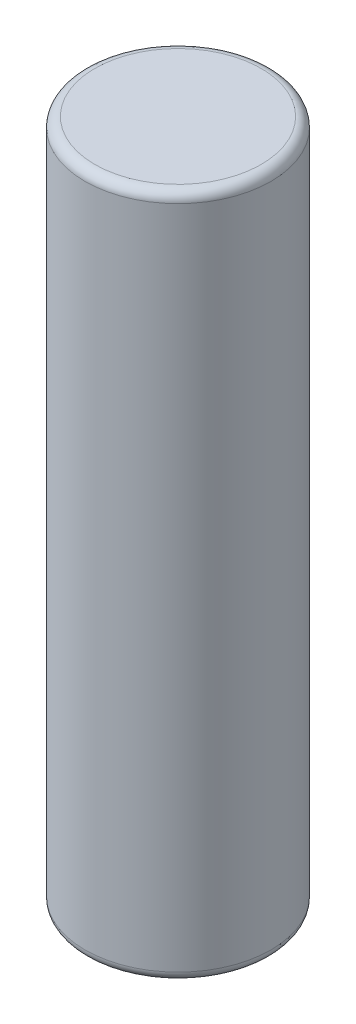
ISO-10303-21;
HEADER;
FILE_DESCRIPTION(('STEP AP214'),'2;1');
FILE_NAME('part.step','',(''),(''),'','','');
FILE_SCHEMA(('AUTOMOTIVE_DESIGN { 1 0 10303 214 1 1 1 1 }'));
ENDSEC;
DATA;
#1=APPLICATION_CONTEXT('core data for automotive mechanical design processes');
#2=APPLICATION_PROTOCOL_DEFINITION('international standard','automotive_design',2000,#1);
#3=PRODUCT_CONTEXT('',#1,'mechanical');
#4=PRODUCT('Part','Part','',(#3));
#5=PRODUCT_RELATED_PRODUCT_CATEGORY('part','',(#4));
#6=PRODUCT_DEFINITION_FORMATION('','',#4);
#7=PRODUCT_DEFINITION_CONTEXT('part definition',#1,'design');
#8=PRODUCT_DEFINITION('design','',#6,#7);
#9=PRODUCT_DEFINITION_SHAPE('','',#8);
#10=(LENGTH_UNIT() NAMED_UNIT(*) SI_UNIT(.MILLI.,.METRE.));
#11=(NAMED_UNIT(*) PLANE_ANGLE_UNIT() SI_UNIT($,.RADIAN.));
#12=(NAMED_UNIT(*) SI_UNIT($,.STERADIAN.) SOLID_ANGLE_UNIT());
#13=UNCERTAINTY_MEASURE_WITH_UNIT(LENGTH_MEASURE(1.E-05),#10,'distance_accuracy_value','');
#14=(GEOMETRIC_REPRESENTATION_CONTEXT(3) GLOBAL_UNCERTAINTY_ASSIGNED_CONTEXT((#13)) GLOBAL_UNIT_ASSIGNED_CONTEXT((#10,
#11,#12)) REPRESENTATION_CONTEXT('',''));
#15=CARTESIAN_POINT('',(0.,0.,0.));
#16=DIRECTION('',(0.,0.,1.));
#17=DIRECTION('',(1.,0.,0.));
#18=AXIS2_PLACEMENT_3D('',#15,#16,#17);
#19=CARTESIAN_POINT('',(0.,70.,0.));
#20=DIRECTION('',(0.,-1.,0.));
#21=DIRECTION('',(0.,0.,-1.));
#22=AXIS2_PLACEMENT_3D('',#19,#20,#21);
#23=CYLINDRICAL_SURFACE('',#22,9.5);
#24=CARTESIAN_POINT('',(0.,1.,0.));
#25=DIRECTION('',(0.,1.,0.));
#26=DIRECTION('',(0.,0.,1.));
#27=AXIS2_PLACEMENT_3D('',#24,#25,#26);
#28=CIRCLE('',#27,9.5);
#29=CARTESIAN_POINT('',(0.,1.,9.5));
#30=VERTEX_POINT('',#29);
#31=EDGE_CURVE('E50',#30,#30,#28,.T.);
#32=ORIENTED_EDGE('',*,*,#31,.T.);
#33=EDGE_LOOP('',(#32));
#34=FACE_BOUND('',#33,.T.);
#35=CARTESIAN_POINT('',(0.,69.,0.));
#36=DIRECTION('',(0.,1.,0.));
#37=DIRECTION('',(0.,0.,1.));
#38=AXIS2_PLACEMENT_3D('',#35,#36,#37);
#39=CIRCLE('',#38,9.5);
#40=CARTESIAN_POINT('',(0.,69.,9.5));
#41=VERTEX_POINT('',#40);
#42=EDGE_CURVE('E54',#41,#41,#39,.F.);
#43=ORIENTED_EDGE('',*,*,#42,.T.);
#44=EDGE_LOOP('',(#43));
#45=FACE_BOUND('',#44,.T.);
#46=ADVANCED_FACE('F39',(#34,#45),#23,.T.);
#47=CARTESIAN_POINT('',(0.,70.,0.));
#48=DIRECTION('',(0.,1.,0.));
#49=DIRECTION('',(0.,0.,1.));
#50=AXIS2_PLACEMENT_3D('',#47,#48,#49);
#51=PLANE('',#50);
#52=CARTESIAN_POINT('',(0.,70.,0.));
#53=DIRECTION('',(0.,1.,0.));
#54=DIRECTION('',(0.,0.,1.));
#55=AXIS2_PLACEMENT_3D('',#52,#53,#54);
#56=CIRCLE('',#55,8.5);
#57=CARTESIAN_POINT('',(0.,70.,8.5));
#58=VERTEX_POINT('',#57);
#59=EDGE_CURVE('E10',#58,#58,#56,.T.);
#60=ORIENTED_EDGE('',*,*,#59,.T.);
#61=EDGE_LOOP('',(#60));
#62=FACE_BOUND('',#61,.T.);
#63=ADVANCED_FACE('F70',(#62),#51,.T.);
#64=CARTESIAN_POINT('',(0.,0.,0.));
#65=DIRECTION('',(0.,1.,0.));
#66=DIRECTION('',(0.,0.,1.));
#67=AXIS2_PLACEMENT_3D('',#64,#65,#66);
#68=PLANE('',#67);
#69=CARTESIAN_POINT('',(0.,0.,0.));
#70=DIRECTION('',(0.,1.,0.));
#71=DIRECTION('',(0.,0.,1.));
#72=AXIS2_PLACEMENT_3D('',#69,#70,#71);
#73=CIRCLE('',#72,8.5);
#74=CARTESIAN_POINT('',(0.,0.,8.5));
#75=VERTEX_POINT('',#74);
#76=EDGE_CURVE('E46',#75,#75,#73,.F.);
#77=ORIENTED_EDGE('',*,*,#76,.T.);
#78=EDGE_LOOP('',(#77));
#79=FACE_BOUND('',#78,.T.);
#80=ADVANCED_FACE('F67',(#79),#68,.F.);
#81=CARTESIAN_POINT('',(0.,1.,0.));
#82=DIRECTION('',(0.,1.,0.));
#83=DIRECTION('',(0.,0.,1.));
#84=AXIS2_PLACEMENT_3D('',#81,#82,#83);
#85=TOROIDAL_SURFACE('',#84,8.5,1.);
#86=ORIENTED_EDGE('',*,*,#76,.F.);
#87=EDGE_LOOP('',(#86));
#88=FACE_BOUND('',#87,.T.);
#89=ORIENTED_EDGE('',*,*,#31,.F.);
#90=EDGE_LOOP('',(#89));
#91=FACE_BOUND('',#90,.T.);
#92=ADVANCED_FACE('F63',(#88,#91),#85,.T.);
#93=CARTESIAN_POINT('',(0.,69.,0.));
#94=DIRECTION('',(0.,1.,0.));
#95=DIRECTION('',(0.,0.,1.));
#96=AXIS2_PLACEMENT_3D('',#93,#94,#95);
#97=TOROIDAL_SURFACE('',#96,8.5,1.);
#98=ORIENTED_EDGE('',*,*,#42,.F.);
#99=EDGE_LOOP('',(#98));
#100=FACE_BOUND('',#99,.T.);
#101=ORIENTED_EDGE('',*,*,#59,.F.);
#102=EDGE_LOOP('',(#101));
#103=FACE_BOUND('',#102,.T.);
#104=ADVANCED_FACE('F41',(#100,#103),#97,.T.);
#105=CLOSED_SHELL('',(#46,#63,#80,#92,#104));
#106=MANIFOLD_SOLID_BREP('B2',#105);
#107=ADVANCED_BREP_SHAPE_REPRESENTATION('',(#18,#106),#14);
#108=SHAPE_DEFINITION_REPRESENTATION(#9,#107);
ENDSEC;
END-ISO-10303-21;
